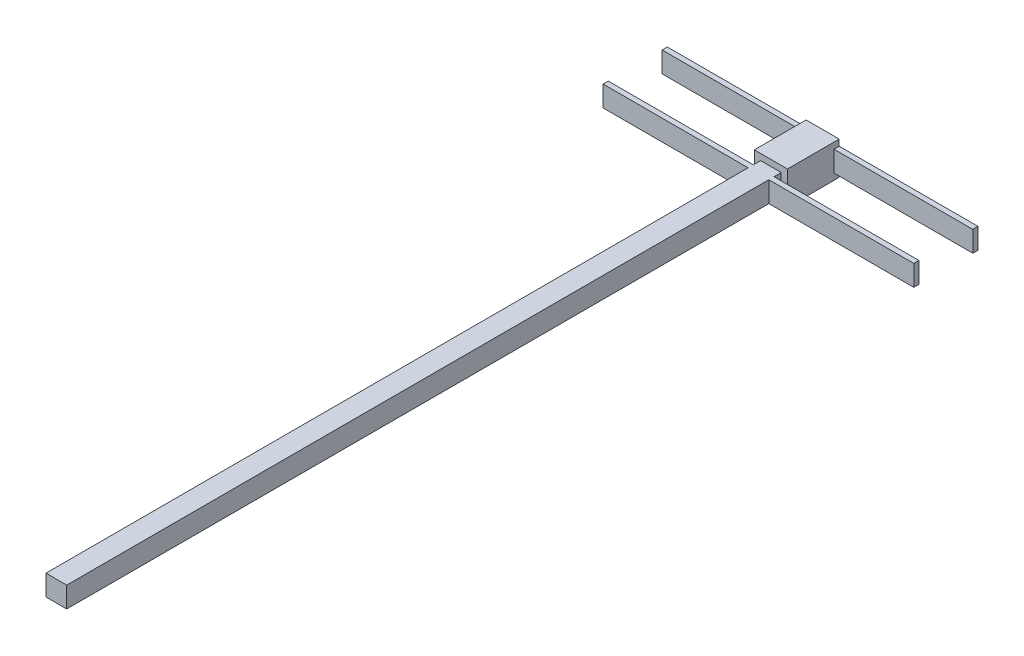
ISO-10303-21;
HEADER;
FILE_DESCRIPTION(('STEP AP214'),'2;1');
FILE_NAME('part.step','',(''),(''),'','','');
FILE_SCHEMA(('AUTOMOTIVE_DESIGN { 1 0 10303 214 1 1 1 1 }'));
ENDSEC;
DATA;
#1=APPLICATION_CONTEXT('core data for automotive mechanical design processes');
#2=APPLICATION_PROTOCOL_DEFINITION('international standard','automotive_design',2000,#1);
#3=PRODUCT_CONTEXT('',#1,'mechanical');
#4=PRODUCT('Part','Part','',(#3));
#5=PRODUCT_RELATED_PRODUCT_CATEGORY('part','',(#4));
#6=PRODUCT_DEFINITION_FORMATION('','',#4);
#7=PRODUCT_DEFINITION_CONTEXT('part definition',#1,'design');
#8=PRODUCT_DEFINITION('design','',#6,#7);
#9=PRODUCT_DEFINITION_SHAPE('','',#8);
#10=(LENGTH_UNIT() NAMED_UNIT(*) SI_UNIT(.MILLI.,.METRE.));
#11=(NAMED_UNIT(*) PLANE_ANGLE_UNIT() SI_UNIT($,.RADIAN.));
#12=(NAMED_UNIT(*) SI_UNIT($,.STERADIAN.) SOLID_ANGLE_UNIT());
#13=UNCERTAINTY_MEASURE_WITH_UNIT(LENGTH_MEASURE(1.E-05),#10,'distance_accuracy_value','');
#14=(GEOMETRIC_REPRESENTATION_CONTEXT(3) GLOBAL_UNCERTAINTY_ASSIGNED_CONTEXT((#13)) GLOBAL_UNIT_ASSIGNED_CONTEXT((#10,
#11,#12)) REPRESENTATION_CONTEXT('',''));
#15=CARTESIAN_POINT('',(0.,0.,0.));
#16=DIRECTION('',(0.,0.,1.));
#17=DIRECTION('',(1.,0.,0.));
#18=AXIS2_PLACEMENT_3D('',#15,#16,#17);
#19=CARTESIAN_POINT('',(10.,10.,690.));
#20=DIRECTION('',(-1.,0.,0.));
#21=DIRECTION('',(0.,-1.,0.));
#22=AXIS2_PLACEMENT_3D('',#19,#20,#21);
#23=PLANE('',#22);
#24=DIRECTION('',(0.,0.,-1.));
#25=VECTOR('',#24,1.);
#26=CARTESIAN_POINT('',(10.,10.,690.));
#27=LINE('',#26,#25);
#28=CARTESIAN_POINT('',(10.,10.,7.00000000000001));
#29=VERTEX_POINT('',#28);
#30=CARTESIAN_POINT('',(10.,10.,0.));
#31=VERTEX_POINT('',#30);
#32=EDGE_CURVE('E467',#29,#31,#27,.T.);
#33=ORIENTED_EDGE('',*,*,#32,.F.);
#34=DIRECTION('',(0.,-1.,0.));
#35=VECTOR('',#34,1.);
#36=CARTESIAN_POINT('',(10.,10.,7.00000000000001));
#37=LINE('',#36,#35);
#38=CARTESIAN_POINT('',(10.,-10.,7.));
#39=VERTEX_POINT('',#38);
#40=EDGE_CURVE('E305',#29,#39,#37,.T.);
#41=ORIENTED_EDGE('',*,*,#40,.T.);
#42=DIRECTION('',(0.,0.,-1.));
#43=VECTOR('',#42,1.);
#44=CARTESIAN_POINT('',(10.,-10.,690.));
#45=LINE('',#44,#43);
#46=CARTESIAN_POINT('',(10.,-10.,0.));
#47=VERTEX_POINT('',#46);
#48=EDGE_CURVE('E449',#39,#47,#45,.T.);
#49=ORIENTED_EDGE('',*,*,#48,.T.);
#50=DIRECTION('',(0.,1.,0.));
#51=VECTOR('',#50,1.);
#52=CARTESIAN_POINT('',(10.,10.,0.));
#53=LINE('',#52,#51);
#54=EDGE_CURVE('E438',#47,#31,#53,.T.);
#55=ORIENTED_EDGE('',*,*,#54,.T.);
#56=EDGE_LOOP('',(#33,#41,#49,#55));
#57=FACE_BOUND('',#56,.T.);
#58=ADVANCED_FACE('F39',(#57),#23,.F.);
#59=CARTESIAN_POINT('',(-10.,10.,690.));
#60=DIRECTION('',(1.,0.,0.));
#61=DIRECTION('',(0.,1.,0.));
#62=AXIS2_PLACEMENT_3D('',#59,#60,#61);
#63=PLANE('',#62);
#64=DIRECTION('',(0.,0.,-1.));
#65=VECTOR('',#64,1.);
#66=CARTESIAN_POINT('',(-10.,-10.,690.));
#67=LINE('',#66,#65);
#68=CARTESIAN_POINT('',(-10.,-10.,7.00000000000001));
#69=VERTEX_POINT('',#68);
#70=CARTESIAN_POINT('',(-10.,-10.,0.));
#71=VERTEX_POINT('',#70);
#72=EDGE_CURVE('E463',#69,#71,#67,.T.);
#73=ORIENTED_EDGE('',*,*,#72,.F.);
#74=DIRECTION('',(0.,1.,0.));
#75=VECTOR('',#74,1.);
#76=CARTESIAN_POINT('',(-10.,10.,7.00000000000001));
#77=LINE('',#76,#75);
#78=CARTESIAN_POINT('',(-10.,10.,7.));
#79=VERTEX_POINT('',#78);
#80=EDGE_CURVE('E302',#69,#79,#77,.T.);
#81=ORIENTED_EDGE('',*,*,#80,.T.);
#82=DIRECTION('',(0.,0.,-1.));
#83=VECTOR('',#82,1.);
#84=CARTESIAN_POINT('',(-10.,10.,690.));
#85=LINE('',#84,#83);
#86=CARTESIAN_POINT('',(-10.,10.,0.));
#87=VERTEX_POINT('',#86);
#88=EDGE_CURVE('E465',#79,#87,#85,.T.);
#89=ORIENTED_EDGE('',*,*,#88,.T.);
#90=DIRECTION('',(0.,-1.,0.));
#91=VECTOR('',#90,1.);
#92=CARTESIAN_POINT('',(-10.,10.,0.));
#93=LINE('',#92,#91);
#94=EDGE_CURVE('E455',#87,#71,#93,.T.);
#95=ORIENTED_EDGE('',*,*,#94,.T.);
#96=EDGE_LOOP('',(#73,#81,#89,#95));
#97=FACE_BOUND('',#96,.T.);
#98=ADVANCED_FACE('F580',(#97),#63,.F.);
#99=CARTESIAN_POINT('',(10.,-10.,690.));
#100=VERTEX_POINT('',#99);
#101=CARTESIAN_POINT('',(10.,-10.,12.));
#102=VERTEX_POINT('',#101);
#103=EDGE_CURVE('E460',#100,#102,#45,.T.);
#104=ORIENTED_EDGE('',*,*,#103,.T.);
#105=DIRECTION('',(0.,1.,0.));
#106=VECTOR('',#105,1.);
#107=CARTESIAN_POINT('',(10.,10.,12.));
#108=LINE('',#107,#106);
#109=CARTESIAN_POINT('',(10.,10.,12.));
#110=VERTEX_POINT('',#109);
#111=EDGE_CURVE('E299',#102,#110,#108,.T.);
#112=ORIENTED_EDGE('',*,*,#111,.T.);
#113=CARTESIAN_POINT('',(10.,10.,690.));
#114=VERTEX_POINT('',#113);
#115=EDGE_CURVE('E468',#114,#110,#27,.T.);
#116=ORIENTED_EDGE('',*,*,#115,.F.);
#117=DIRECTION('',(0.,1.,0.));
#118=VECTOR('',#117,1.);
#119=CARTESIAN_POINT('',(10.,10.,690.));
#120=LINE('',#119,#118);
#121=EDGE_CURVE('E439',#100,#114,#120,.T.);
#122=ORIENTED_EDGE('',*,*,#121,.F.);
#123=EDGE_LOOP('',(#104,#112,#116,#122));
#124=FACE_BOUND('',#123,.T.);
#125=ADVANCED_FACE('F41',(#124),#23,.F.);
#126=CARTESIAN_POINT('',(-10.,10.,690.));
#127=DIRECTION('',(0.,-1.,0.));
#128=DIRECTION('',(0.,0.,-1.));
#129=AXIS2_PLACEMENT_3D('',#126,#127,#128);
#130=PLANE('',#129);
#131=ORIENTED_EDGE('',*,*,#115,.T.);
#132=DIRECTION('',(1.,0.,0.));
#133=VECTOR('',#132,1.);
#134=CARTESIAN_POINT('',(-150.,10.,12.));
#135=LINE('',#134,#133);
#136=CARTESIAN_POINT('',(150.,10.,12.));
#137=VERTEX_POINT('',#136);
#138=EDGE_CURVE('E288',#110,#137,#135,.T.);
#139=ORIENTED_EDGE('',*,*,#138,.T.);
#140=DIRECTION('',(0.,0.,-1.));
#141=VECTOR('',#140,1.);
#142=CARTESIAN_POINT('',(150.,10.,12.));
#143=LINE('',#142,#141);
#144=CARTESIAN_POINT('',(150.,10.,7.));
#145=VERTEX_POINT('',#144);
#146=EDGE_CURVE('E290',#137,#145,#143,.T.);
#147=ORIENTED_EDGE('',*,*,#146,.T.);
#148=DIRECTION('',(-1.,0.,0.));
#149=VECTOR('',#148,1.);
#150=CARTESIAN_POINT('',(-150.,10.,7.));
#151=LINE('',#150,#149);
#152=EDGE_CURVE('E54',#145,#29,#151,.T.);
#153=ORIENTED_EDGE('',*,*,#152,.T.);
#154=ORIENTED_EDGE('',*,*,#32,.T.);
#155=DIRECTION('',(-1.,0.,0.));
#156=VECTOR('',#155,1.);
#157=CARTESIAN_POINT('',(-10.,10.,0.));
#158=LINE('',#157,#156);
#159=EDGE_CURVE('E452',#31,#87,#158,.T.);
#160=ORIENTED_EDGE('',*,*,#159,.T.);
#161=ORIENTED_EDGE('',*,*,#88,.F.);
#162=CARTESIAN_POINT('',(-150.,10.,7.));
#163=VERTEX_POINT('',#162);
#164=EDGE_CURVE('E279',#79,#163,#151,.T.);
#165=ORIENTED_EDGE('',*,*,#164,.T.);
#166=DIRECTION('',(0.,0.,1.));
#167=VECTOR('',#166,1.);
#168=CARTESIAN_POINT('',(-150.,10.,12.));
#169=LINE('',#168,#167);
#170=CARTESIAN_POINT('',(-150.,10.,12.));
#171=VERTEX_POINT('',#170);
#172=EDGE_CURVE('E286',#163,#171,#169,.T.);
#173=ORIENTED_EDGE('',*,*,#172,.T.);
#174=CARTESIAN_POINT('',(-10.,10.,12.));
#175=VERTEX_POINT('',#174);
#176=EDGE_CURVE('E254',#171,#175,#135,.T.);
#177=ORIENTED_EDGE('',*,*,#176,.T.);
#178=CARTESIAN_POINT('',(-10.,10.,690.));
#179=VERTEX_POINT('',#178);
#180=EDGE_CURVE('E62',#179,#175,#85,.T.);
#181=ORIENTED_EDGE('',*,*,#180,.F.);
#182=DIRECTION('',(-1.,0.,0.));
#183=VECTOR('',#182,1.);
#184=CARTESIAN_POINT('',(-10.,10.,690.));
#185=LINE('',#184,#183);
#186=EDGE_CURVE('E442',#114,#179,#185,.T.);
#187=ORIENTED_EDGE('',*,*,#186,.F.);
#188=EDGE_LOOP('',(#131,#139,#147,#153,#154,#160,#161,#165,#173,#177,#181,#187));
#189=FACE_BOUND('',#188,.T.);
#190=ADVANCED_FACE('F590',(#189),#130,.F.);
#191=ORIENTED_EDGE('',*,*,#180,.T.);
#192=DIRECTION('',(0.,-1.,0.));
#193=VECTOR('',#192,1.);
#194=CARTESIAN_POINT('',(-10.,10.,12.));
#195=LINE('',#194,#193);
#196=CARTESIAN_POINT('',(-10.,-10.,12.));
#197=VERTEX_POINT('',#196);
#198=EDGE_CURVE('E293',#175,#197,#195,.T.);
#199=ORIENTED_EDGE('',*,*,#198,.T.);
#200=CARTESIAN_POINT('',(-10.,-10.,690.));
#201=VERTEX_POINT('',#200);
#202=EDGE_CURVE('E270',#201,#197,#67,.T.);
#203=ORIENTED_EDGE('',*,*,#202,.F.);
#204=DIRECTION('',(0.,-1.,0.));
#205=VECTOR('',#204,1.);
#206=CARTESIAN_POINT('',(-10.,10.,690.));
#207=LINE('',#206,#205);
#208=EDGE_CURVE('E445',#179,#201,#207,.T.);
#209=ORIENTED_EDGE('',*,*,#208,.F.);
#210=EDGE_LOOP('',(#191,#199,#203,#209));
#211=FACE_BOUND('',#210,.T.);
#212=ADVANCED_FACE('F587',(#211),#63,.F.);
#213=CARTESIAN_POINT('',(-10.,-10.,690.));
#214=DIRECTION('',(0.,1.,0.));
#215=DIRECTION('',(0.,0.,1.));
#216=AXIS2_PLACEMENT_3D('',#213,#214,#215);
#217=PLANE('',#216);
#218=ORIENTED_EDGE('',*,*,#202,.T.);
#219=DIRECTION('',(1.,0.,0.));
#220=VECTOR('',#219,1.);
#221=CARTESIAN_POINT('',(-150.,-10.,12.));
#222=LINE('',#221,#220);
#223=CARTESIAN_POINT('',(-150.,-10.,12.));
#224=VERTEX_POINT('',#223);
#225=EDGE_CURVE('E252',#224,#197,#222,.T.);
#226=ORIENTED_EDGE('',*,*,#225,.F.);
#227=DIRECTION('',(0.,0.,1.));
#228=VECTOR('',#227,1.);
#229=CARTESIAN_POINT('',(-150.,-10.,12.));
#230=LINE('',#229,#228);
#231=CARTESIAN_POINT('',(-150.,-10.,7.));
#232=VERTEX_POINT('',#231);
#233=EDGE_CURVE('E267',#232,#224,#230,.T.);
#234=ORIENTED_EDGE('',*,*,#233,.F.);
#235=DIRECTION('',(-1.,0.,0.));
#236=VECTOR('',#235,1.);
#237=CARTESIAN_POINT('',(-150.,-10.,7.));
#238=LINE('',#237,#236);
#239=EDGE_CURVE('E284',#69,#232,#238,.T.);
#240=ORIENTED_EDGE('',*,*,#239,.F.);
#241=ORIENTED_EDGE('',*,*,#72,.T.);
#242=DIRECTION('',(1.,0.,0.));
#243=VECTOR('',#242,1.);
#244=CARTESIAN_POINT('',(-10.,-10.,0.));
#245=LINE('',#244,#243);
#246=EDGE_CURVE('E443',#71,#47,#245,.T.);
#247=ORIENTED_EDGE('',*,*,#246,.T.);
#248=ORIENTED_EDGE('',*,*,#48,.F.);
#249=CARTESIAN_POINT('',(150.,-10.,7.));
#250=VERTEX_POINT('',#249);
#251=EDGE_CURVE('E260',#250,#39,#238,.T.);
#252=ORIENTED_EDGE('',*,*,#251,.F.);
#253=DIRECTION('',(0.,0.,-1.));
#254=VECTOR('',#253,1.);
#255=CARTESIAN_POINT('',(150.,-10.,12.));
#256=LINE('',#255,#254);
#257=CARTESIAN_POINT('',(150.,-10.,12.));
#258=VERTEX_POINT('',#257);
#259=EDGE_CURVE('E271',#258,#250,#256,.T.);
#260=ORIENTED_EDGE('',*,*,#259,.F.);
#261=EDGE_CURVE('E272',#102,#258,#222,.T.);
#262=ORIENTED_EDGE('',*,*,#261,.F.);
#263=ORIENTED_EDGE('',*,*,#103,.F.);
#264=DIRECTION('',(1.,0.,0.));
#265=VECTOR('',#264,1.);
#266=CARTESIAN_POINT('',(-10.,-10.,690.));
#267=LINE('',#266,#265);
#268=EDGE_CURVE('E447',#201,#100,#267,.T.);
#269=ORIENTED_EDGE('',*,*,#268,.F.);
#270=EDGE_LOOP('',(#218,#226,#234,#240,#241,#247,#248,#252,#260,#262,#263,#269));
#271=FACE_BOUND('',#270,.T.);
#272=ADVANCED_FACE('F265',(#271),#217,.F.);
#273=CARTESIAN_POINT('',(0.,0.,690.));
#274=DIRECTION('',(0.,0.,1.));
#275=DIRECTION('',(1.,0.,0.));
#276=AXIS2_PLACEMENT_3D('',#273,#274,#275);
#277=PLANE('',#276);
#278=ORIENTED_EDGE('',*,*,#121,.T.);
#279=ORIENTED_EDGE('',*,*,#186,.T.);
#280=ORIENTED_EDGE('',*,*,#208,.T.);
#281=ORIENTED_EDGE('',*,*,#268,.T.);
#282=EDGE_LOOP('',(#278,#279,#280,#281));
#283=FACE_BOUND('',#282,.T.);
#284=ADVANCED_FACE('F889',(#283),#277,.T.);
#285=CARTESIAN_POINT('',(-16.,16.,-50.));
#286=DIRECTION('',(1.,0.,0.));
#287=DIRECTION('',(0.,1.,0.));
#288=AXIS2_PLACEMENT_3D('',#285,#286,#287);
#289=PLANE('',#288);
#290=DIRECTION('',(0.,-1.,0.));
#291=VECTOR('',#290,1.);
#292=CARTESIAN_POINT('',(-16.,16.,-45.));
#293=LINE('',#292,#291);
#294=CARTESIAN_POINT('',(-16.,10.,-45.));
#295=VERTEX_POINT('',#294);
#296=CARTESIAN_POINT('',(-16.,-10.,-45.));
#297=VERTEX_POINT('',#296);
#298=EDGE_CURVE('E369',#295,#297,#293,.T.);
#299=ORIENTED_EDGE('',*,*,#298,.T.);
#300=DIRECTION('',(0.,0.,-1.));
#301=VECTOR('',#300,1.);
#302=CARTESIAN_POINT('',(-16.,-10.,-50.));
#303=LINE('',#302,#301);
#304=CARTESIAN_POINT('',(-16.,-10.,-50.));
#305=VERTEX_POINT('',#304);
#306=EDGE_CURVE('E363',#297,#305,#303,.T.);
#307=ORIENTED_EDGE('',*,*,#306,.T.);
#308=DIRECTION('',(0.,1.,0.));
#309=VECTOR('',#308,1.);
#310=CARTESIAN_POINT('',(-16.,16.,-50.));
#311=LINE('',#310,#309);
#312=CARTESIAN_POINT('',(-16.,-16.,-50.));
#313=VERTEX_POINT('',#312);
#314=EDGE_CURVE('E406',#313,#305,#311,.T.);
#315=ORIENTED_EDGE('',*,*,#314,.F.);
#316=DIRECTION('',(0.,0.,1.));
#317=VECTOR('',#316,1.);
#318=CARTESIAN_POINT('',(-16.,-16.,-50.));
#319=LINE('',#318,#317);
#320=CARTESIAN_POINT('',(-16.,-16.,0.));
#321=VERTEX_POINT('',#320);
#322=EDGE_CURVE('E418',#313,#321,#319,.T.);
#323=ORIENTED_EDGE('',*,*,#322,.T.);
#324=DIRECTION('',(0.,1.,0.));
#325=VECTOR('',#324,1.);
#326=CARTESIAN_POINT('',(-16.,16.,0.));
#327=LINE('',#326,#325);
#328=CARTESIAN_POINT('',(-16.,16.,0.));
#329=VERTEX_POINT('',#328);
#330=EDGE_CURVE('E398',#321,#329,#327,.T.);
#331=ORIENTED_EDGE('',*,*,#330,.T.);
#332=DIRECTION('',(0.,0.,1.));
#333=VECTOR('',#332,1.);
#334=CARTESIAN_POINT('',(-16.,16.,-50.));
#335=LINE('',#334,#333);
#336=CARTESIAN_POINT('',(-16.,16.,-50.));
#337=VERTEX_POINT('',#336);
#338=EDGE_CURVE('E435',#337,#329,#335,.T.);
#339=ORIENTED_EDGE('',*,*,#338,.F.);
#340=CARTESIAN_POINT('',(-16.,10.,-50.));
#341=VERTEX_POINT('',#340);
#342=EDGE_CURVE('E410',#341,#337,#311,.T.);
#343=ORIENTED_EDGE('',*,*,#342,.F.);
#344=DIRECTION('',(0.,0.,-1.));
#345=VECTOR('',#344,1.);
#346=CARTESIAN_POINT('',(-16.,10.,-50.));
#347=LINE('',#346,#345);
#348=EDGE_CURVE('E356',#295,#341,#347,.T.);
#349=ORIENTED_EDGE('',*,*,#348,.F.);
#350=EDGE_LOOP('',(#299,#307,#315,#323,#331,#339,#343,#349));
#351=FACE_BOUND('',#350,.T.);
#352=ADVANCED_FACE('F558',(#351),#289,.F.);
#353=CARTESIAN_POINT('',(16.,16.,-50.));
#354=DIRECTION('',(0.,-1.,0.));
#355=DIRECTION('',(0.,0.,-1.));
#356=AXIS2_PLACEMENT_3D('',#353,#354,#355);
#357=PLANE('',#356);
#358=DIRECTION('',(1.,0.,0.));
#359=VECTOR('',#358,1.);
#360=CARTESIAN_POINT('',(16.,16.,0.));
#361=LINE('',#360,#359);
#362=CARTESIAN_POINT('',(16.,16.,0.));
#363=VERTEX_POINT('',#362);
#364=EDGE_CURVE('E421',#329,#363,#361,.T.);
#365=ORIENTED_EDGE('',*,*,#364,.T.);
#366=DIRECTION('',(0.,0.,1.));
#367=VECTOR('',#366,1.);
#368=CARTESIAN_POINT('',(16.,16.,-50.));
#369=LINE('',#368,#367);
#370=CARTESIAN_POINT('',(16.,16.,-50.));
#371=VERTEX_POINT('',#370);
#372=EDGE_CURVE('E432',#371,#363,#369,.T.);
#373=ORIENTED_EDGE('',*,*,#372,.F.);
#374=DIRECTION('',(1.,0.,0.));
#375=VECTOR('',#374,1.);
#376=CARTESIAN_POINT('',(16.,16.,-50.));
#377=LINE('',#376,#375);
#378=EDGE_CURVE('E409',#337,#371,#377,.T.);
#379=ORIENTED_EDGE('',*,*,#378,.F.);
#380=ORIENTED_EDGE('',*,*,#338,.T.);
#381=EDGE_LOOP('',(#365,#373,#379,#380));
#382=FACE_BOUND('',#381,.T.);
#383=ADVANCED_FACE('F556',(#382),#357,.F.);
#384=CARTESIAN_POINT('',(16.,16.,-50.));
#385=DIRECTION('',(-1.,0.,0.));
#386=DIRECTION('',(0.,-1.,0.));
#387=AXIS2_PLACEMENT_3D('',#384,#385,#386);
#388=PLANE('',#387);
#389=DIRECTION('',(0.,-1.,0.));
#390=VECTOR('',#389,1.);
#391=CARTESIAN_POINT('',(16.,16.,-50.));
#392=LINE('',#391,#390);
#393=CARTESIAN_POINT('',(16.,-10.,-50.));
#394=VERTEX_POINT('',#393);
#395=CARTESIAN_POINT('',(16.,-16.,-50.));
#396=VERTEX_POINT('',#395);
#397=EDGE_CURVE('E412',#394,#396,#392,.T.);
#398=ORIENTED_EDGE('',*,*,#397,.F.);
#399=DIRECTION('',(0.,0.,1.));
#400=VECTOR('',#399,1.);
#401=CARTESIAN_POINT('',(16.,-10.,-50.));
#402=LINE('',#401,#400);
#403=CARTESIAN_POINT('',(16.,-10.,-45.));
#404=VERTEX_POINT('',#403);
#405=EDGE_CURVE('E361',#394,#404,#402,.T.);
#406=ORIENTED_EDGE('',*,*,#405,.T.);
#407=DIRECTION('',(0.,1.,0.));
#408=VECTOR('',#407,1.);
#409=CARTESIAN_POINT('',(16.,16.,-45.));
#410=LINE('',#409,#408);
#411=CARTESIAN_POINT('',(16.,10.,-45.));
#412=VERTEX_POINT('',#411);
#413=EDGE_CURVE('E367',#404,#412,#410,.T.);
#414=ORIENTED_EDGE('',*,*,#413,.T.);
#415=DIRECTION('',(0.,0.,1.));
#416=VECTOR('',#415,1.);
#417=CARTESIAN_POINT('',(16.,10.,-50.));
#418=LINE('',#417,#416);
#419=CARTESIAN_POINT('',(16.,10.,-50.));
#420=VERTEX_POINT('',#419);
#421=EDGE_CURVE('E353',#420,#412,#418,.T.);
#422=ORIENTED_EDGE('',*,*,#421,.F.);
#423=EDGE_CURVE('E413',#371,#420,#392,.T.);
#424=ORIENTED_EDGE('',*,*,#423,.F.);
#425=ORIENTED_EDGE('',*,*,#372,.T.);
#426=DIRECTION('',(0.,-1.,0.));
#427=VECTOR('',#426,1.);
#428=CARTESIAN_POINT('',(16.,16.,0.));
#429=LINE('',#428,#427);
#430=CARTESIAN_POINT('',(16.,-16.,0.));
#431=VERTEX_POINT('',#430);
#432=EDGE_CURVE('E423',#363,#431,#429,.T.);
#433=ORIENTED_EDGE('',*,*,#432,.T.);
#434=DIRECTION('',(0.,0.,1.));
#435=VECTOR('',#434,1.);
#436=CARTESIAN_POINT('',(16.,-16.,-50.));
#437=LINE('',#436,#435);
#438=EDGE_CURVE('E429',#396,#431,#437,.T.);
#439=ORIENTED_EDGE('',*,*,#438,.F.);
#440=EDGE_LOOP('',(#398,#406,#414,#422,#424,#425,#433,#439));
#441=FACE_BOUND('',#440,.T.);
#442=ADVANCED_FACE('F566',(#441),#388,.F.);
#443=CARTESIAN_POINT('',(16.,-16.,-50.));
#444=DIRECTION('',(0.,1.,0.));
#445=DIRECTION('',(0.,0.,1.));
#446=AXIS2_PLACEMENT_3D('',#443,#444,#445);
#447=PLANE('',#446);
#448=DIRECTION('',(-1.,0.,0.));
#449=VECTOR('',#448,1.);
#450=CARTESIAN_POINT('',(16.,-16.,0.));
#451=LINE('',#450,#449);
#452=EDGE_CURVE('E425',#431,#321,#451,.T.);
#453=ORIENTED_EDGE('',*,*,#452,.T.);
#454=ORIENTED_EDGE('',*,*,#322,.F.);
#455=DIRECTION('',(-1.,0.,0.));
#456=VECTOR('',#455,1.);
#457=CARTESIAN_POINT('',(16.,-16.,-50.));
#458=LINE('',#457,#456);
#459=EDGE_CURVE('E416',#396,#313,#458,.T.);
#460=ORIENTED_EDGE('',*,*,#459,.F.);
#461=ORIENTED_EDGE('',*,*,#438,.T.);
#462=EDGE_LOOP('',(#453,#454,#460,#461));
#463=FACE_BOUND('',#462,.T.);
#464=ADVANCED_FACE('F569',(#463),#447,.F.);
#465=CARTESIAN_POINT('',(0.,0.,-50.));
#466=DIRECTION('',(0.,0.,-1.));
#467=DIRECTION('',(-1.,0.,0.));
#468=AXIS2_PLACEMENT_3D('',#465,#466,#467);
#469=PLANE('',#468);
#470=DIRECTION('',(0.,-1.,0.));
#471=VECTOR('',#470,1.);
#472=CARTESIAN_POINT('',(15.,15.,-50.));
#473=LINE('',#472,#471);
#474=CARTESIAN_POINT('',(15.,-10.,-50.));
#475=VERTEX_POINT('',#474);
#476=CARTESIAN_POINT('',(15.,-15.,-50.));
#477=VERTEX_POINT('',#476);
#478=EDGE_CURVE('E391',#475,#477,#473,.T.);
#479=ORIENTED_EDGE('',*,*,#478,.F.);
#480=DIRECTION('',(-1.,0.,0.));
#481=VECTOR('',#480,1.);
#482=CARTESIAN_POINT('',(-150.,-10.,-50.));
#483=LINE('',#482,#481);
#484=CARTESIAN_POINT('',(-15.,-10.,-50.));
#485=VERTEX_POINT('',#484);
#486=EDGE_CURVE('E326',#475,#485,#483,.T.);
#487=ORIENTED_EDGE('',*,*,#486,.T.);
#488=DIRECTION('',(0.,1.,0.));
#489=VECTOR('',#488,1.);
#490=CARTESIAN_POINT('',(-15.,15.,-50.));
#491=LINE('',#490,#489);
#492=CARTESIAN_POINT('',(-15.,-15.,-50.));
#493=VERTEX_POINT('',#492);
#494=EDGE_CURVE('E386',#493,#485,#491,.T.);
#495=ORIENTED_EDGE('',*,*,#494,.F.);
#496=DIRECTION('',(-1.,0.,0.));
#497=VECTOR('',#496,1.);
#498=CARTESIAN_POINT('',(15.,-15.,-50.));
#499=LINE('',#498,#497);
#500=EDGE_CURVE('E376',#477,#493,#499,.T.);
#501=ORIENTED_EDGE('',*,*,#500,.F.);
#502=EDGE_LOOP('',(#479,#487,#495,#501));
#503=FACE_BOUND('',#502,.T.);
#504=ORIENTED_EDGE('',*,*,#423,.T.);
#505=DIRECTION('',(-1.,0.,0.));
#506=VECTOR('',#505,1.);
#507=CARTESIAN_POINT('',(-150.,10.,-50.));
#508=LINE('',#507,#506);
#509=CARTESIAN_POINT('',(150.,10.,-50.));
#510=VERTEX_POINT('',#509);
#511=EDGE_CURVE('E313',#510,#420,#508,.T.);
#512=ORIENTED_EDGE('',*,*,#511,.F.);
#513=DIRECTION('',(0.,1.,0.));
#514=VECTOR('',#513,1.);
#515=CARTESIAN_POINT('',(150.,-10.,-50.));
#516=LINE('',#515,#514);
#517=CARTESIAN_POINT('',(150.,-10.,-50.));
#518=VERTEX_POINT('',#517);
#519=EDGE_CURVE('E345',#518,#510,#516,.T.);
#520=ORIENTED_EDGE('',*,*,#519,.F.);
#521=EDGE_CURVE('E322',#518,#394,#483,.T.);
#522=ORIENTED_EDGE('',*,*,#521,.T.);
#523=ORIENTED_EDGE('',*,*,#397,.T.);
#524=ORIENTED_EDGE('',*,*,#459,.T.);
#525=ORIENTED_EDGE('',*,*,#314,.T.);
#526=CARTESIAN_POINT('',(-150.,-10.,-50.));
#527=VERTEX_POINT('',#526);
#528=EDGE_CURVE('E321',#305,#527,#483,.T.);
#529=ORIENTED_EDGE('',*,*,#528,.T.);
#530=DIRECTION('',(0.,1.,0.));
#531=VECTOR('',#530,1.);
#532=CARTESIAN_POINT('',(-150.,-10.,-50.));
#533=LINE('',#532,#531);
#534=CARTESIAN_POINT('',(-150.,10.,-50.));
#535=VERTEX_POINT('',#534);
#536=EDGE_CURVE('E341',#527,#535,#533,.T.);
#537=ORIENTED_EDGE('',*,*,#536,.T.);
#538=EDGE_CURVE('E337',#341,#535,#508,.T.);
#539=ORIENTED_EDGE('',*,*,#538,.F.);
#540=ORIENTED_EDGE('',*,*,#342,.T.);
#541=ORIENTED_EDGE('',*,*,#378,.T.);
#542=EDGE_LOOP('',(#504,#512,#520,#522,#523,#524,#525,#529,#537,#539,#540,#541));
#543=FACE_BOUND('',#542,.T.);
#544=CARTESIAN_POINT('',(15.,10.,-50.));
#545=VERTEX_POINT('',#544);
#546=CARTESIAN_POINT('',(-15.,10.,-50.));
#547=VERTEX_POINT('',#546);
#548=EDGE_CURVE('E340',#545,#547,#508,.T.);
#549=ORIENTED_EDGE('',*,*,#548,.F.);
#550=CARTESIAN_POINT('',(15.,15.,-50.));
#551=VERTEX_POINT('',#550);
#552=EDGE_CURVE('E392',#551,#545,#473,.T.);
#553=ORIENTED_EDGE('',*,*,#552,.F.);
#554=DIRECTION('',(1.,0.,0.));
#555=VECTOR('',#554,1.);
#556=CARTESIAN_POINT('',(15.,15.,-50.));
#557=LINE('',#556,#555);
#558=CARTESIAN_POINT('',(-15.,15.,-50.));
#559=VERTEX_POINT('',#558);
#560=EDGE_CURVE('E388',#559,#551,#557,.T.);
#561=ORIENTED_EDGE('',*,*,#560,.F.);
#562=EDGE_CURVE('E371',#547,#559,#491,.T.);
#563=ORIENTED_EDGE('',*,*,#562,.F.);
#564=EDGE_LOOP('',(#549,#553,#561,#563));
#565=FACE_BOUND('',#564,.T.);
#566=ADVANCED_FACE('F505',(#503,#543,#565),#469,.T.);
#567=CARTESIAN_POINT('',(0.,0.,0.));
#568=DIRECTION('',(0.,0.,-1.));
#569=DIRECTION('',(-1.,0.,0.));
#570=AXIS2_PLACEMENT_3D('',#567,#568,#569);
#571=PLANE('',#570);
#572=ORIENTED_EDGE('',*,*,#54,.F.);
#573=ORIENTED_EDGE('',*,*,#246,.F.);
#574=ORIENTED_EDGE('',*,*,#94,.F.);
#575=ORIENTED_EDGE('',*,*,#159,.F.);
#576=EDGE_LOOP('',(#572,#573,#574,#575));
#577=FACE_BOUND('',#576,.T.);
#578=ORIENTED_EDGE('',*,*,#330,.F.);
#579=ORIENTED_EDGE('',*,*,#452,.F.);
#580=ORIENTED_EDGE('',*,*,#432,.F.);
#581=ORIENTED_EDGE('',*,*,#364,.F.);
#582=EDGE_LOOP('',(#578,#579,#580,#581));
#583=FACE_BOUND('',#582,.T.);
#584=ADVANCED_FACE('F563',(#577,#583),#571,.F.);
#585=CARTESIAN_POINT('',(-15.,15.,-4.));
#586=DIRECTION('',(-1.,0.,0.));
#587=DIRECTION('',(0.,-1.,0.));
#588=AXIS2_PLACEMENT_3D('',#585,#586,#587);
#589=PLANE('',#588);
#590=ORIENTED_EDGE('',*,*,#494,.T.);
#591=DIRECTION('',(0.,0.,1.));
#592=VECTOR('',#591,1.);
#593=CARTESIAN_POINT('',(-15.,-10.,-4.));
#594=LINE('',#593,#592);
#595=CARTESIAN_POINT('',(-15.,-10.,-45.));
#596=VERTEX_POINT('',#595);
#597=EDGE_CURVE('E359',#485,#596,#594,.T.);
#598=ORIENTED_EDGE('',*,*,#597,.T.);
#599=DIRECTION('',(0.,1.,0.));
#600=VECTOR('',#599,1.);
#601=CARTESIAN_POINT('',(-15.,15.,-45.));
#602=LINE('',#601,#600);
#603=CARTESIAN_POINT('',(-15.,10.,-45.));
#604=VERTEX_POINT('',#603);
#605=EDGE_CURVE('E365',#596,#604,#602,.T.);
#606=ORIENTED_EDGE('',*,*,#605,.T.);
#607=DIRECTION('',(0.,0.,1.));
#608=VECTOR('',#607,1.);
#609=CARTESIAN_POINT('',(-15.,10.,-4.));
#610=LINE('',#609,#608);
#611=EDGE_CURVE('E344',#547,#604,#610,.T.);
#612=ORIENTED_EDGE('',*,*,#611,.F.);
#613=ORIENTED_EDGE('',*,*,#562,.T.);
#614=DIRECTION('',(0.,0.,-1.));
#615=VECTOR('',#614,1.);
#616=CARTESIAN_POINT('',(-15.,15.,-4.));
#617=LINE('',#616,#615);
#618=CARTESIAN_POINT('',(-15.,15.,-4.));
#619=VERTEX_POINT('',#618);
#620=EDGE_CURVE('E385',#619,#559,#617,.T.);
#621=ORIENTED_EDGE('',*,*,#620,.F.);
#622=DIRECTION('',(0.,1.,0.));
#623=VECTOR('',#622,1.);
#624=CARTESIAN_POINT('',(-15.,15.,-4.));
#625=LINE('',#624,#623);
#626=CARTESIAN_POINT('',(-15.,-15.,-4.));
#627=VERTEX_POINT('',#626);
#628=EDGE_CURVE('E372',#627,#619,#625,.T.);
#629=ORIENTED_EDGE('',*,*,#628,.F.);
#630=DIRECTION('',(0.,0.,-1.));
#631=VECTOR('',#630,1.);
#632=CARTESIAN_POINT('',(-15.,-15.,-4.));
#633=LINE('',#632,#631);
#634=EDGE_CURVE('E396',#627,#493,#633,.T.);
#635=ORIENTED_EDGE('',*,*,#634,.T.);
#636=EDGE_LOOP('',(#590,#598,#606,#612,#613,#621,#629,#635));
#637=FACE_BOUND('',#636,.T.);
#638=ADVANCED_FACE('F517',(#637),#589,.F.);
#639=CARTESIAN_POINT('',(15.,-15.,-4.));
#640=DIRECTION('',(0.,-1.,0.));
#641=DIRECTION('',(0.,0.,-1.));
#642=AXIS2_PLACEMENT_3D('',#639,#640,#641);
#643=PLANE('',#642);
#644=ORIENTED_EDGE('',*,*,#500,.T.);
#645=ORIENTED_EDGE('',*,*,#634,.F.);
#646=DIRECTION('',(-1.,0.,0.));
#647=VECTOR('',#646,1.);
#648=CARTESIAN_POINT('',(15.,-15.,-4.));
#649=LINE('',#648,#647);
#650=CARTESIAN_POINT('',(15.,-15.,-4.));
#651=VERTEX_POINT('',#650);
#652=EDGE_CURVE('E382',#651,#627,#649,.T.);
#653=ORIENTED_EDGE('',*,*,#652,.F.);
#654=DIRECTION('',(0.,0.,-1.));
#655=VECTOR('',#654,1.);
#656=CARTESIAN_POINT('',(15.,-15.,-4.));
#657=LINE('',#656,#655);
#658=EDGE_CURVE('E399',#651,#477,#657,.T.);
#659=ORIENTED_EDGE('',*,*,#658,.T.);
#660=EDGE_LOOP('',(#644,#645,#653,#659));
#661=FACE_BOUND('',#660,.T.);
#662=ADVANCED_FACE('F529',(#661),#643,.F.);
#663=CARTESIAN_POINT('',(15.,15.,-4.));
#664=DIRECTION('',(1.,0.,0.));
#665=DIRECTION('',(0.,1.,0.));
#666=AXIS2_PLACEMENT_3D('',#663,#664,#665);
#667=PLANE('',#666);
#668=DIRECTION('',(0.,-1.,0.));
#669=VECTOR('',#668,1.);
#670=CARTESIAN_POINT('',(15.,15.,-45.));
#671=LINE('',#670,#669);
#672=CARTESIAN_POINT('',(15.,10.,-45.));
#673=VERTEX_POINT('',#672);
#674=CARTESIAN_POINT('',(15.,-10.,-45.));
#675=VERTEX_POINT('',#674);
#676=EDGE_CURVE('E47',#673,#675,#671,.T.);
#677=ORIENTED_EDGE('',*,*,#676,.T.);
#678=DIRECTION('',(0.,0.,-1.));
#679=VECTOR('',#678,1.);
#680=CARTESIAN_POINT('',(15.,-10.,-4.));
#681=LINE('',#680,#679);
#682=EDGE_CURVE('E11',#675,#475,#681,.T.);
#683=ORIENTED_EDGE('',*,*,#682,.T.);
#684=ORIENTED_EDGE('',*,*,#478,.T.);
#685=ORIENTED_EDGE('',*,*,#658,.F.);
#686=DIRECTION('',(0.,-1.,0.));
#687=VECTOR('',#686,1.);
#688=CARTESIAN_POINT('',(15.,15.,-4.));
#689=LINE('',#688,#687);
#690=CARTESIAN_POINT('',(15.,15.,-4.));
#691=VERTEX_POINT('',#690);
#692=EDGE_CURVE('E379',#691,#651,#689,.T.);
#693=ORIENTED_EDGE('',*,*,#692,.F.);
#694=DIRECTION('',(0.,0.,-1.));
#695=VECTOR('',#694,1.);
#696=CARTESIAN_POINT('',(15.,15.,-4.));
#697=LINE('',#696,#695);
#698=EDGE_CURVE('E402',#691,#551,#697,.T.);
#699=ORIENTED_EDGE('',*,*,#698,.T.);
#700=ORIENTED_EDGE('',*,*,#552,.T.);
#701=DIRECTION('',(0.,0.,-1.));
#702=VECTOR('',#701,1.);
#703=CARTESIAN_POINT('',(15.,10.,-4.));
#704=LINE('',#703,#702);
#705=EDGE_CURVE('E471',#673,#545,#704,.T.);
#706=ORIENTED_EDGE('',*,*,#705,.F.);
#707=EDGE_LOOP('',(#677,#683,#684,#685,#693,#699,#700,#706));
#708=FACE_BOUND('',#707,.T.);
#709=ADVANCED_FACE('F476',(#708),#667,.F.);
#710=CARTESIAN_POINT('',(15.,15.,-4.));
#711=DIRECTION('',(0.,1.,0.));
#712=DIRECTION('',(0.,0.,1.));
#713=AXIS2_PLACEMENT_3D('',#710,#711,#712);
#714=PLANE('',#713);
#715=ORIENTED_EDGE('',*,*,#560,.T.);
#716=ORIENTED_EDGE('',*,*,#698,.F.);
#717=DIRECTION('',(1.,0.,0.));
#718=VECTOR('',#717,1.);
#719=CARTESIAN_POINT('',(15.,15.,-4.));
#720=LINE('',#719,#718);
#721=EDGE_CURVE('E375',#619,#691,#720,.T.);
#722=ORIENTED_EDGE('',*,*,#721,.F.);
#723=ORIENTED_EDGE('',*,*,#620,.T.);
#724=EDGE_LOOP('',(#715,#716,#722,#723));
#725=FACE_BOUND('',#724,.T.);
#726=ADVANCED_FACE('F521',(#725),#714,.F.);
#727=CARTESIAN_POINT('',(0.,0.,-4.));
#728=DIRECTION('',(0.,0.,-1.));
#729=DIRECTION('',(-1.,0.,0.));
#730=AXIS2_PLACEMENT_3D('',#727,#728,#729);
#731=PLANE('',#730);
#732=ORIENTED_EDGE('',*,*,#628,.T.);
#733=ORIENTED_EDGE('',*,*,#721,.T.);
#734=ORIENTED_EDGE('',*,*,#692,.T.);
#735=ORIENTED_EDGE('',*,*,#652,.T.);
#736=EDGE_LOOP('',(#732,#733,#734,#735));
#737=FACE_BOUND('',#736,.T.);
#738=ADVANCED_FACE('F527',(#737),#731,.T.);
#739=CARTESIAN_POINT('',(0.,10.,0.));
#740=DIRECTION('',(0.,-1.,0.));
#741=DIRECTION('',(0.,0.,-1.));
#742=AXIS2_PLACEMENT_3D('',#739,#740,#741);
#743=PLANE('',#742);
#744=ORIENTED_EDGE('',*,*,#548,.T.);
#745=ORIENTED_EDGE('',*,*,#611,.T.);
#746=DIRECTION('',(1.,0.,0.));
#747=VECTOR('',#746,1.);
#748=CARTESIAN_POINT('',(-150.,10.,-45.));
#749=LINE('',#748,#747);
#750=EDGE_CURVE('E334',#604,#673,#749,.T.);
#751=ORIENTED_EDGE('',*,*,#750,.T.);
#752=ORIENTED_EDGE('',*,*,#705,.T.);
#753=EDGE_LOOP('',(#744,#745,#751,#752));
#754=FACE_BOUND('',#753,.T.);
#755=ADVANCED_FACE('F513',(#754),#743,.F.);
#756=CARTESIAN_POINT('',(0.,-10.,0.));
#757=DIRECTION('',(0.,-1.,0.));
#758=DIRECTION('',(0.,0.,-1.));
#759=AXIS2_PLACEMENT_3D('',#756,#757,#758);
#760=PLANE('',#759);
#761=ORIENTED_EDGE('',*,*,#597,.F.);
#762=ORIENTED_EDGE('',*,*,#486,.F.);
#763=ORIENTED_EDGE('',*,*,#682,.F.);
#764=DIRECTION('',(1.,0.,0.));
#765=VECTOR('',#764,1.);
#766=CARTESIAN_POINT('',(-150.,-10.,-45.));
#767=LINE('',#766,#765);
#768=EDGE_CURVE('E318',#596,#675,#767,.T.);
#769=ORIENTED_EDGE('',*,*,#768,.F.);
#770=EDGE_LOOP('',(#761,#762,#763,#769));
#771=FACE_BOUND('',#770,.T.);
#772=ADVANCED_FACE('F486',(#771),#760,.T.);
#773=CARTESIAN_POINT('',(-150.,-10.,-45.));
#774=DIRECTION('',(0.,0.,1.));
#775=DIRECTION('',(1.,0.,0.));
#776=AXIS2_PLACEMENT_3D('',#773,#774,#775);
#777=PLANE('',#776);
#778=ORIENTED_EDGE('',*,*,#605,.F.);
#779=ORIENTED_EDGE('',*,*,#768,.T.);
#780=ORIENTED_EDGE('',*,*,#676,.F.);
#781=ORIENTED_EDGE('',*,*,#750,.F.);
#782=EDGE_LOOP('',(#778,#779,#780,#781));
#783=FACE_BOUND('',#782,.T.);
#784=ADVANCED_FACE('F489',(#783),#777,.T.);
#785=CARTESIAN_POINT('',(150.,-10.,-45.));
#786=DIRECTION('',(1.,0.,0.));
#787=DIRECTION('',(0.,0.,-1.));
#788=AXIS2_PLACEMENT_3D('',#785,#786,#787);
#789=PLANE('',#788);
#790=DIRECTION('',(0.,0.,-1.));
#791=VECTOR('',#790,1.);
#792=CARTESIAN_POINT('',(150.,10.,-45.));
#793=LINE('',#792,#791);
#794=CARTESIAN_POINT('',(150.,10.,-45.));
#795=VERTEX_POINT('',#794);
#796=EDGE_CURVE('E333',#795,#510,#793,.T.);
#797=ORIENTED_EDGE('',*,*,#796,.F.);
#798=DIRECTION('',(0.,1.,0.));
#799=VECTOR('',#798,1.);
#800=CARTESIAN_POINT('',(150.,-10.,-45.));
#801=LINE('',#800,#799);
#802=CARTESIAN_POINT('',(150.,-10.,-45.));
#803=VERTEX_POINT('',#802);
#804=EDGE_CURVE('E347',#803,#795,#801,.T.);
#805=ORIENTED_EDGE('',*,*,#804,.F.);
#806=DIRECTION('',(0.,0.,-1.));
#807=VECTOR('',#806,1.);
#808=CARTESIAN_POINT('',(150.,-10.,-45.));
#809=LINE('',#808,#807);
#810=EDGE_CURVE('E317',#803,#518,#809,.T.);
#811=ORIENTED_EDGE('',*,*,#810,.T.);
#812=ORIENTED_EDGE('',*,*,#519,.T.);
#813=EDGE_LOOP('',(#797,#805,#811,#812));
#814=FACE_BOUND('',#813,.T.);
#815=ADVANCED_FACE('F501',(#814),#789,.T.);
#816=ORIENTED_EDGE('',*,*,#511,.T.);
#817=ORIENTED_EDGE('',*,*,#421,.T.);
#818=EDGE_CURVE('E329',#412,#795,#749,.T.);
#819=ORIENTED_EDGE('',*,*,#818,.T.);
#820=ORIENTED_EDGE('',*,*,#796,.T.);
#821=EDGE_LOOP('',(#816,#817,#819,#820));
#822=FACE_BOUND('',#821,.T.);
#823=ADVANCED_FACE('F510',(#822),#743,.F.);
#824=ORIENTED_EDGE('',*,*,#405,.F.);
#825=ORIENTED_EDGE('',*,*,#521,.F.);
#826=ORIENTED_EDGE('',*,*,#810,.F.);
#827=EDGE_CURVE('E312',#404,#803,#767,.T.);
#828=ORIENTED_EDGE('',*,*,#827,.F.);
#829=EDGE_LOOP('',(#824,#825,#826,#828));
#830=FACE_BOUND('',#829,.T.);
#831=ADVANCED_FACE('F503',(#830),#760,.T.);
#832=ORIENTED_EDGE('',*,*,#413,.F.);
#833=ORIENTED_EDGE('',*,*,#827,.T.);
#834=ORIENTED_EDGE('',*,*,#804,.T.);
#835=ORIENTED_EDGE('',*,*,#818,.F.);
#836=EDGE_LOOP('',(#832,#833,#834,#835));
#837=FACE_BOUND('',#836,.T.);
#838=ADVANCED_FACE('F494',(#837),#777,.T.);
#839=ORIENTED_EDGE('',*,*,#298,.F.);
#840=CARTESIAN_POINT('',(-150.,10.,-45.));
#841=VERTEX_POINT('',#840);
#842=EDGE_CURVE('E330',#841,#295,#749,.T.);
#843=ORIENTED_EDGE('',*,*,#842,.F.);
#844=DIRECTION('',(0.,1.,0.));
#845=VECTOR('',#844,1.);
#846=CARTESIAN_POINT('',(-150.,-10.,-45.));
#847=LINE('',#846,#845);
#848=CARTESIAN_POINT('',(-150.,-10.,-45.));
#849=VERTEX_POINT('',#848);
#850=EDGE_CURVE('E325',#849,#841,#847,.T.);
#851=ORIENTED_EDGE('',*,*,#850,.F.);
#852=EDGE_CURVE('E314',#849,#297,#767,.T.);
#853=ORIENTED_EDGE('',*,*,#852,.T.);
#854=EDGE_LOOP('',(#839,#843,#851,#853));
#855=FACE_BOUND('',#854,.T.);
#856=ADVANCED_FACE('F547',(#855),#777,.T.);
#857=ORIENTED_EDGE('',*,*,#306,.F.);
#858=ORIENTED_EDGE('',*,*,#852,.F.);
#859=DIRECTION('',(0.,0.,1.));
#860=VECTOR('',#859,1.);
#861=CARTESIAN_POINT('',(-150.,-10.,-45.));
#862=LINE('',#861,#860);
#863=EDGE_CURVE('E309',#527,#849,#862,.T.);
#864=ORIENTED_EDGE('',*,*,#863,.F.);
#865=ORIENTED_EDGE('',*,*,#528,.F.);
#866=EDGE_LOOP('',(#857,#858,#864,#865));
#867=FACE_BOUND('',#866,.T.);
#868=ADVANCED_FACE('F544',(#867),#760,.T.);
#869=ORIENTED_EDGE('',*,*,#842,.T.);
#870=ORIENTED_EDGE('',*,*,#348,.T.);
#871=ORIENTED_EDGE('',*,*,#538,.T.);
#872=DIRECTION('',(0.,0.,1.));
#873=VECTOR('',#872,1.);
#874=CARTESIAN_POINT('',(-150.,10.,-45.));
#875=LINE('',#874,#873);
#876=EDGE_CURVE('E308',#535,#841,#875,.T.);
#877=ORIENTED_EDGE('',*,*,#876,.T.);
#878=EDGE_LOOP('',(#869,#870,#871,#877));
#879=FACE_BOUND('',#878,.T.);
#880=ADVANCED_FACE('F550',(#879),#743,.F.);
#881=CARTESIAN_POINT('',(-150.,-10.,-45.));
#882=DIRECTION('',(-1.,0.,0.));
#883=DIRECTION('',(0.,0.,1.));
#884=AXIS2_PLACEMENT_3D('',#881,#882,#883);
#885=PLANE('',#884);
#886=ORIENTED_EDGE('',*,*,#876,.F.);
#887=ORIENTED_EDGE('',*,*,#536,.F.);
#888=ORIENTED_EDGE('',*,*,#863,.T.);
#889=ORIENTED_EDGE('',*,*,#850,.T.);
#890=EDGE_LOOP('',(#886,#887,#888,#889));
#891=FACE_BOUND('',#890,.T.);
#892=ADVANCED_FACE('F542',(#891),#885,.T.);
#893=CARTESIAN_POINT('',(-150.,-10.,12.));
#894=DIRECTION('',(-1.,0.,0.));
#895=DIRECTION('',(0.,0.,1.));
#896=AXIS2_PLACEMENT_3D('',#893,#894,#895);
#897=PLANE('',#896);
#898=ORIENTED_EDGE('',*,*,#172,.F.);
#899=DIRECTION('',(0.,1.,0.));
#900=VECTOR('',#899,1.);
#901=CARTESIAN_POINT('',(-150.,-10.,7.));
#902=LINE('',#901,#900);
#903=EDGE_CURVE('E277',#232,#163,#902,.T.);
#904=ORIENTED_EDGE('',*,*,#903,.F.);
#905=ORIENTED_EDGE('',*,*,#233,.T.);
#906=DIRECTION('',(0.,1.,0.));
#907=VECTOR('',#906,1.);
#908=CARTESIAN_POINT('',(-150.,-10.,12.));
#909=LINE('',#908,#907);
#910=EDGE_CURVE('E249',#224,#171,#909,.T.);
#911=ORIENTED_EDGE('',*,*,#910,.T.);
#912=EDGE_LOOP('',(#898,#904,#905,#911));
#913=FACE_BOUND('',#912,.T.);
#914=ADVANCED_FACE('F275',(#913),#897,.T.);
#915=CARTESIAN_POINT('',(-150.,-10.,12.));
#916=DIRECTION('',(0.,0.,1.));
#917=DIRECTION('',(1.,0.,0.));
#918=AXIS2_PLACEMENT_3D('',#915,#916,#917);
#919=PLANE('',#918);
#920=ORIENTED_EDGE('',*,*,#198,.F.);
#921=ORIENTED_EDGE('',*,*,#176,.F.);
#922=ORIENTED_EDGE('',*,*,#910,.F.);
#923=ORIENTED_EDGE('',*,*,#225,.T.);
#924=EDGE_LOOP('',(#920,#921,#922,#923));
#925=FACE_BOUND('',#924,.T.);
#926=ADVANCED_FACE('F251',(#925),#919,.T.);
#927=CARTESIAN_POINT('',(-150.,-10.,7.));
#928=DIRECTION('',(0.,0.,-1.));
#929=DIRECTION('',(-1.,0.,0.));
#930=AXIS2_PLACEMENT_3D('',#927,#928,#929);
#931=PLANE('',#930);
#932=ORIENTED_EDGE('',*,*,#80,.F.);
#933=ORIENTED_EDGE('',*,*,#239,.T.);
#934=ORIENTED_EDGE('',*,*,#903,.T.);
#935=ORIENTED_EDGE('',*,*,#164,.F.);
#936=EDGE_LOOP('',(#932,#933,#934,#935));
#937=FACE_BOUND('',#936,.T.);
#938=ADVANCED_FACE('F618',(#937),#931,.T.);
#939=ORIENTED_EDGE('',*,*,#40,.F.);
#940=ORIENTED_EDGE('',*,*,#152,.F.);
#941=DIRECTION('',(0.,1.,0.));
#942=VECTOR('',#941,1.);
#943=CARTESIAN_POINT('',(150.,-10.,7.));
#944=LINE('',#943,#942);
#945=EDGE_CURVE('E294',#250,#145,#944,.T.);
#946=ORIENTED_EDGE('',*,*,#945,.F.);
#947=ORIENTED_EDGE('',*,*,#251,.T.);
#948=EDGE_LOOP('',(#939,#940,#946,#947));
#949=FACE_BOUND('',#948,.T.);
#950=ADVANCED_FACE('F608',(#949),#931,.T.);
#951=ORIENTED_EDGE('',*,*,#111,.F.);
#952=ORIENTED_EDGE('',*,*,#261,.T.);
#953=DIRECTION('',(0.,1.,0.));
#954=VECTOR('',#953,1.);
#955=CARTESIAN_POINT('',(150.,-10.,12.));
#956=LINE('',#955,#954);
#957=EDGE_CURVE('E259',#258,#137,#956,.T.);
#958=ORIENTED_EDGE('',*,*,#957,.T.);
#959=ORIENTED_EDGE('',*,*,#138,.F.);
#960=EDGE_LOOP('',(#951,#952,#958,#959));
#961=FACE_BOUND('',#960,.T.);
#962=ADVANCED_FACE('F603',(#961),#919,.T.);
#963=CARTESIAN_POINT('',(150.,-10.,12.));
#964=DIRECTION('',(1.,0.,0.));
#965=DIRECTION('',(0.,0.,-1.));
#966=AXIS2_PLACEMENT_3D('',#963,#964,#965);
#967=PLANE('',#966);
#968=ORIENTED_EDGE('',*,*,#146,.F.);
#969=ORIENTED_EDGE('',*,*,#957,.F.);
#970=ORIENTED_EDGE('',*,*,#259,.T.);
#971=ORIENTED_EDGE('',*,*,#945,.T.);
#972=EDGE_LOOP('',(#968,#969,#970,#971));
#973=FACE_BOUND('',#972,.T.);
#974=ADVANCED_FACE('F606',(#973),#967,.T.);
#975=CLOSED_SHELL('',(#58,#98,#125,#190,#212,#272,#284,#352,#383,#442,#464,#566,#584,#638,#662,
#709,#726,#738,#755,#772,#784,#815,#823,#831,#838,#856,#868,#880,#892,#914,#926,#938,#950,#962,#974));
#976=MANIFOLD_SOLID_BREP('B2',#975);
#977=ADVANCED_BREP_SHAPE_REPRESENTATION('',(#18,#976),#14);
#978=SHAPE_DEFINITION_REPRESENTATION(#9,#977);
ENDSEC;
END-ISO-10303-21;
